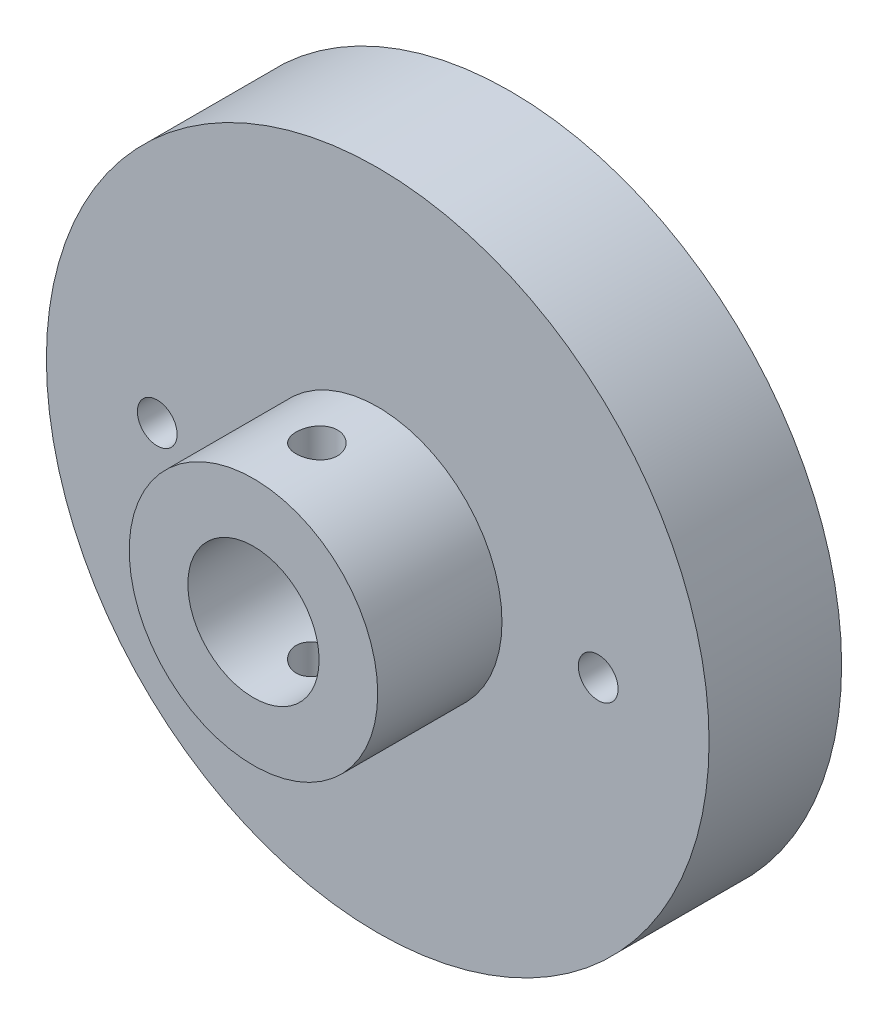
ISO-10303-21;
HEADER;
FILE_DESCRIPTION(('STEP AP214'),'2;1');
FILE_NAME('part.step','',(''),(''),'','','');
FILE_SCHEMA(('AUTOMOTIVE_DESIGN { 1 0 10303 214 1 1 1 1 }'));
ENDSEC;
DATA;
#1=APPLICATION_CONTEXT('core data for automotive mechanical design processes');
#2=APPLICATION_PROTOCOL_DEFINITION('international standard','automotive_design',2000,#1);
#3=PRODUCT_CONTEXT('',#1,'mechanical');
#4=PRODUCT('Part','Part','',(#3));
#5=PRODUCT_RELATED_PRODUCT_CATEGORY('part','',(#4));
#6=PRODUCT_DEFINITION_FORMATION('','',#4);
#7=PRODUCT_DEFINITION_CONTEXT('part definition',#1,'design');
#8=PRODUCT_DEFINITION('design','',#6,#7);
#9=PRODUCT_DEFINITION_SHAPE('','',#8);
#10=(LENGTH_UNIT() NAMED_UNIT(*) SI_UNIT(.MILLI.,.METRE.));
#11=(NAMED_UNIT(*) PLANE_ANGLE_UNIT() SI_UNIT($,.RADIAN.));
#12=(NAMED_UNIT(*) SI_UNIT($,.STERADIAN.) SOLID_ANGLE_UNIT());
#13=UNCERTAINTY_MEASURE_WITH_UNIT(LENGTH_MEASURE(1.E-05),#10,'distance_accuracy_value','');
#14=(GEOMETRIC_REPRESENTATION_CONTEXT(3) GLOBAL_UNCERTAINTY_ASSIGNED_CONTEXT((#13)) GLOBAL_UNIT_ASSIGNED_CONTEXT((#10,
#11,#12)) REPRESENTATION_CONTEXT('',''));
#15=CARTESIAN_POINT('',(0.,0.,0.));
#16=DIRECTION('',(0.,0.,1.));
#17=DIRECTION('',(1.,0.,0.));
#18=AXIS2_PLACEMENT_3D('',#15,#16,#17);
#19=CARTESIAN_POINT('',(0.,0.,5.08));
#20=DIRECTION('',(0.,0.,-1.));
#21=DIRECTION('',(-1.,0.,0.));
#22=AXIS2_PLACEMENT_3D('',#19,#20,#21);
#23=CYLINDRICAL_SURFACE('',#22,12.7);
#24=CARTESIAN_POINT('',(0.,0.,5.08));
#25=DIRECTION('',(0.,0.,1.));
#26=DIRECTION('',(1.,0.,0.));
#27=AXIS2_PLACEMENT_3D('',#24,#25,#26);
#28=CIRCLE('',#27,12.7);
#29=CARTESIAN_POINT('',(12.7,0.,5.08));
#30=VERTEX_POINT('',#29);
#31=EDGE_CURVE('E10',#30,#30,#28,.T.);
#32=ORIENTED_EDGE('',*,*,#31,.F.);
#33=EDGE_LOOP('',(#32));
#34=FACE_BOUND('',#33,.T.);
#35=CARTESIAN_POINT('',(0.,0.,0.));
#36=DIRECTION('',(0.,0.,1.));
#37=DIRECTION('',(1.,0.,0.));
#38=AXIS2_PLACEMENT_3D('',#35,#36,#37);
#39=CIRCLE('',#38,12.7);
#40=CARTESIAN_POINT('',(12.7,0.,0.));
#41=VERTEX_POINT('',#40);
#42=EDGE_CURVE('E49',#41,#41,#39,.T.);
#43=ORIENTED_EDGE('',*,*,#42,.T.);
#44=EDGE_LOOP('',(#43));
#45=FACE_BOUND('',#44,.T.);
#46=ADVANCED_FACE('F36',(#34,#45),#23,.T.);
#47=CARTESIAN_POINT('',(0.,0.,5.08));
#48=DIRECTION('',(0.,0.,1.));
#49=DIRECTION('',(1.,0.,0.));
#50=AXIS2_PLACEMENT_3D('',#47,#48,#49);
#51=PLANE('',#50);
#52=CARTESIAN_POINT('',(0.,0.,5.08));
#53=DIRECTION('',(0.,0.,1.));
#54=DIRECTION('',(1.,0.,0.));
#55=AXIS2_PLACEMENT_3D('',#52,#53,#54);
#56=CIRCLE('',#55,4.7625);
#57=CARTESIAN_POINT('',(4.7625,0.,5.08));
#58=VERTEX_POINT('',#57);
#59=EDGE_CURVE('E188',#58,#58,#56,.T.);
#60=ORIENTED_EDGE('',*,*,#59,.F.);
#61=EDGE_LOOP('',(#60));
#62=FACE_BOUND('',#61,.T.);
#63=CARTESIAN_POINT('',(-8.45058,0.,5.08));
#64=DIRECTION('',(0.,0.,1.));
#65=DIRECTION('',(1.,0.,0.));
#66=AXIS2_PLACEMENT_3D('',#63,#64,#65);
#67=CIRCLE('',#66,0.761999999999999);
#68=CARTESIAN_POINT('',(-7.68858,0.,5.08));
#69=VERTEX_POINT('',#68);
#70=EDGE_CURVE('E201',#69,#69,#67,.T.);
#71=ORIENTED_EDGE('',*,*,#70,.F.);
#72=EDGE_LOOP('',(#71));
#73=FACE_BOUND('',#72,.T.);
#74=CARTESIAN_POINT('',(8.45058,0.,5.08));
#75=DIRECTION('',(0.,0.,1.));
#76=DIRECTION('',(1.,0.,0.));
#77=AXIS2_PLACEMENT_3D('',#74,#75,#76);
#78=CIRCLE('',#77,0.762000000000001);
#79=CARTESIAN_POINT('',(9.21258,0.,5.08));
#80=VERTEX_POINT('',#79);
#81=EDGE_CURVE('E58',#80,#80,#78,.T.);
#82=ORIENTED_EDGE('',*,*,#81,.F.);
#83=EDGE_LOOP('',(#82));
#84=FACE_BOUND('',#83,.T.);
#85=ORIENTED_EDGE('',*,*,#31,.T.);
#86=EDGE_LOOP('',(#85));
#87=FACE_BOUND('',#86,.T.);
#88=ADVANCED_FACE('F107',(#62,#73,#84,#87),#51,.T.);
#89=CARTESIAN_POINT('',(0.,0.,0.));
#90=DIRECTION('',(0.,0.,1.));
#91=DIRECTION('',(1.,0.,0.));
#92=AXIS2_PLACEMENT_3D('',#89,#90,#91);
#93=PLANE('',#92);
#94=CARTESIAN_POINT('',(0.,0.,0.));
#95=DIRECTION('',(0.,0.,1.));
#96=DIRECTION('',(1.,0.,0.));
#97=AXIS2_PLACEMENT_3D('',#94,#95,#96);
#98=CIRCLE('',#97,2.5146);
#99=CARTESIAN_POINT('',(2.5146,0.,0.));
#100=VERTEX_POINT('',#99);
#101=EDGE_CURVE('E190',#100,#100,#98,.T.);
#102=ORIENTED_EDGE('',*,*,#101,.T.);
#103=EDGE_LOOP('',(#102));
#104=FACE_BOUND('',#103,.T.);
#105=CARTESIAN_POINT('',(-8.45058,0.,0.));
#106=DIRECTION('',(0.,0.,1.));
#107=DIRECTION('',(1.,0.,0.));
#108=AXIS2_PLACEMENT_3D('',#105,#106,#107);
#109=CIRCLE('',#108,0.761999999999999);
#110=CARTESIAN_POINT('',(-7.68858,0.,0.));
#111=VERTEX_POINT('',#110);
#112=EDGE_CURVE('E55',#111,#111,#109,.T.);
#113=ORIENTED_EDGE('',*,*,#112,.T.);
#114=EDGE_LOOP('',(#113));
#115=FACE_BOUND('',#114,.T.);
#116=CARTESIAN_POINT('',(8.45058,0.,0.));
#117=DIRECTION('',(0.,0.,1.));
#118=DIRECTION('',(1.,0.,0.));
#119=AXIS2_PLACEMENT_3D('',#116,#117,#118);
#120=CIRCLE('',#119,0.762000000000001);
#121=CARTESIAN_POINT('',(9.21258,0.,0.));
#122=VERTEX_POINT('',#121);
#123=EDGE_CURVE('E204',#122,#122,#120,.T.);
#124=ORIENTED_EDGE('',*,*,#123,.T.);
#125=EDGE_LOOP('',(#124));
#126=FACE_BOUND('',#125,.T.);
#127=ORIENTED_EDGE('',*,*,#42,.F.);
#128=EDGE_LOOP('',(#127));
#129=FACE_BOUND('',#128,.T.);
#130=ADVANCED_FACE('F105',(#104,#115,#126,#129),#93,.F.);
#131=CARTESIAN_POINT('',(8.45058,0.,0.));
#132=DIRECTION('',(0.,0.,1.));
#133=DIRECTION('',(1.,0.,0.));
#134=AXIS2_PLACEMENT_3D('',#131,#132,#133);
#135=CYLINDRICAL_SURFACE('',#134,0.762000000000001);
#136=ORIENTED_EDGE('',*,*,#123,.F.);
#137=EDGE_LOOP('',(#136));
#138=FACE_BOUND('',#137,.T.);
#139=ORIENTED_EDGE('',*,*,#81,.T.);
#140=EDGE_LOOP('',(#139));
#141=FACE_BOUND('',#140,.T.);
#142=ADVANCED_FACE('F101',(#138,#141),#135,.F.);
#143=CARTESIAN_POINT('',(-8.45058,0.,0.));
#144=DIRECTION('',(0.,0.,1.));
#145=DIRECTION('',(1.,0.,0.));
#146=AXIS2_PLACEMENT_3D('',#143,#144,#145);
#147=CYLINDRICAL_SURFACE('',#146,0.761999999999999);
#148=ORIENTED_EDGE('',*,*,#112,.F.);
#149=EDGE_LOOP('',(#148));
#150=FACE_BOUND('',#149,.T.);
#151=ORIENTED_EDGE('',*,*,#70,.T.);
#152=EDGE_LOOP('',(#151));
#153=FACE_BOUND('',#152,.T.);
#154=ADVANCED_FACE('F96',(#150,#153),#147,.F.);
#155=CARTESIAN_POINT('',(0.,0.,9.8425));
#156=DIRECTION('',(0.,0.,-1.));
#157=DIRECTION('',(-1.,0.,0.));
#158=AXIS2_PLACEMENT_3D('',#155,#156,#157);
#159=CYLINDRICAL_SURFACE('',#158,4.7625);
#160=CARTESIAN_POINT('',(0.,-4.7625,8.20729272143013));
#161=CARTESIAN_POINT('',(0.0442566123242315,-4.76249924171101,8.2072909469392));
#162=CARTESIAN_POINT('',(0.0885373774838239,-4.76187667737388,8.2035788366275));
#163=CARTESIAN_POINT('',(0.175856970381189,-4.7594530951889,8.18883464977214));
#164=CARTESIAN_POINT('',(0.218894618077059,-4.75765099370835,8.1777958421107));
#165=CARTESIAN_POINT('',(0.302452007240013,-4.75307046665073,8.14874081650193));
#166=CARTESIAN_POINT('',(0.342973776977127,-4.75029283988044,8.13073030608925));
#167=CARTESIAN_POINT('',(0.420415034827996,-4.74406667098557,8.0882580687035));
#168=CARTESIAN_POINT('',(0.457334934286451,-4.74061820560783,8.06379707957928));
#169=CARTESIAN_POINT('',(0.526882555037607,-4.73339578293014,8.00886948231714));
#170=CARTESIAN_POINT('',(0.559470846872351,-4.72961929301217,7.97835327753316));
#171=CARTESIAN_POINT('',(0.619089598324525,-4.72218584033363,7.91228824144002));
#172=CARTESIAN_POINT('',(0.646119707056632,-4.71852888513147,7.87673909264266));
#173=CARTESIAN_POINT('',(0.694012812379628,-4.7117240212873,7.80134643966257));
#174=CARTESIAN_POINT('',(0.714836820533366,-4.70857938486594,7.76147784699462));
#175=CARTESIAN_POINT('',(0.74947728101806,-4.70319033259809,7.67874743476469));
#176=CARTESIAN_POINT('',(0.76329420669708,-4.70094585594543,7.63588581761249));
#177=CARTESIAN_POINT('',(0.783404064946675,-4.69763645447575,7.54880398416318));
#178=CARTESIAN_POINT('',(0.789765066750488,-4.6965608649421,7.50459990009094));
#179=CARTESIAN_POINT('',(0.794993560279533,-4.69567875612386,7.41573973351963));
#180=CARTESIAN_POINT('',(0.793861582323505,-4.69587214702666,7.37108368323202));
#181=CARTESIAN_POINT('',(0.784191693740776,-4.69749641164179,7.28307312547518));
#182=CARTESIAN_POINT('',(0.775730250000001,-4.69891450778756,7.23970994630452));
#183=CARTESIAN_POINT('',(0.751761622078092,-4.70280839729495,7.15502745301938));
#184=CARTESIAN_POINT('',(0.736254196246516,-4.70528422693264,7.11370820905802));
#185=CARTESIAN_POINT('',(0.698556275634816,-4.71102842188577,7.03405756998764));
#186=CARTESIAN_POINT('',(0.676334027656808,-4.71430053806576,6.99574148499934));
#187=CARTESIAN_POINT('',(0.625859815574484,-4.72126601596765,6.9233530742592));
#188=CARTESIAN_POINT('',(0.597607364807735,-4.72495941167736,6.88928109137569));
#189=CARTESIAN_POINT('',(0.535458102360498,-4.73240743851832,6.8259054391863));
#190=CARTESIAN_POINT('',(0.501495683529717,-4.7361622613105,6.79666609179366));
#191=CARTESIAN_POINT('',(0.429112441551671,-4.7432677594346,6.74429153178389));
#192=CARTESIAN_POINT('',(0.390691589680287,-4.74661843216244,6.72115635849696));
#193=CARTESIAN_POINT('',(0.310421628382929,-4.752542859935,6.68164101431436));
#194=CARTESIAN_POINT('',(0.268569670366778,-4.75511596094364,6.66526652579246));
#195=CARTESIAN_POINT('',(0.182657224728865,-4.75919007206519,6.63979705808954));
#196=CARTESIAN_POINT('',(0.138596922189479,-4.76069117186275,6.63070146994098));
#197=CARTESIAN_POINT('',(0.0500728936632639,-4.76244008725053,6.62013519011872));
#198=CARTESIAN_POINT('',(0.00561998404544439,-4.76270241581559,6.61857619738185));
#199=CARTESIAN_POINT('',(-0.082911877892541,-4.76198398128722,6.62289194828606));
#200=CARTESIAN_POINT('',(-0.126990844535724,-4.76100326602408,6.62876640590009));
#201=CARTESIAN_POINT('',(-0.213250835736099,-4.75791792552879,6.64770886109415));
#202=CARTESIAN_POINT('',(-0.255441725712359,-4.75582013274416,6.660733142594));
#203=CARTESIAN_POINT('',(-0.337041135943192,-4.75073492464576,6.69355893095848));
#204=CARTESIAN_POINT('',(-0.376449499801337,-4.74774745937566,6.71336081840433));
#205=CARTESIAN_POINT('',(-0.451748743906395,-4.74117833926014,6.75938195352136));
#206=CARTESIAN_POINT('',(-0.487605467172546,-4.7375916674413,6.78565635851324));
#207=CARTESIAN_POINT('',(-0.554432338397105,-4.73023713396929,6.84380081906489));
#208=CARTESIAN_POINT('',(-0.585402131103666,-4.72646925916966,6.87567128107047));
#209=CARTESIAN_POINT('',(-0.641903332541417,-4.71913005637381,6.94449919294281));
#210=CARTESIAN_POINT('',(-0.667375081653606,-4.71556116873531,6.98150591898096));
#211=CARTESIAN_POINT('',(-0.711740483518659,-4.70906960704478,7.05932478913162));
#212=CARTESIAN_POINT('',(-0.73063434478942,-4.70614691250961,7.10013681256486));
#213=CARTESIAN_POINT('',(-0.761218420242726,-4.70129696549021,7.18424096159799));
#214=CARTESIAN_POINT('',(-0.772938329833974,-4.69936561493763,7.22752204160231));
#215=CARTESIAN_POINT('',(-0.788935256574605,-4.69670675095195,7.31547336245804));
#216=CARTESIAN_POINT('',(-0.79321292079291,-4.69597913286014,7.36014348219506));
#217=CARTESIAN_POINT('',(-0.794185884970036,-4.69581462754174,7.4490091116232));
#218=CARTESIAN_POINT('',(-0.790975093219748,-4.69636175440544,7.49320359162779));
#219=CARTESIAN_POINT('',(-0.777265348868801,-4.69865005611559,7.58041413268625));
#220=CARTESIAN_POINT('',(-0.766766419890713,-4.70039122709185,7.62343019755918));
#221=CARTESIAN_POINT('',(-0.738814400446383,-4.70486535619446,7.70702652527054));
#222=CARTESIAN_POINT('',(-0.721369395015642,-4.70759716092245,7.74760955712292));
#223=CARTESIAN_POINT('',(-0.680030073743303,-4.71374587132801,7.8252880463995));
#224=CARTESIAN_POINT('',(-0.656135438027671,-4.71716281098317,7.86238333072328));
#225=CARTESIAN_POINT('',(-0.602239995788161,-4.72434746659485,7.93250776906685));
#226=CARTESIAN_POINT('',(-0.572170103940985,-4.72811886345476,7.96548345673247));
#227=CARTESIAN_POINT('',(-0.506923367463225,-4.73555813224567,8.02595310585093));
#228=CARTESIAN_POINT('',(-0.471745345849764,-4.73922598008428,8.05344580047275));
#229=CARTESIAN_POINT('',(-0.396992211360791,-4.74607423161405,8.10234254658362));
#230=CARTESIAN_POINT('',(-0.357388410041672,-4.74925109410361,8.12370323891199));
#231=CARTESIAN_POINT('',(-0.275117899527829,-4.75472495713564,8.15943578279378));
#232=CARTESIAN_POINT('',(-0.232454289608531,-4.7570228334635,8.17381459467294));
#233=CARTESIAN_POINT('',(-0.158020800939417,-4.75997838589463,8.19205439596535));
#234=CARTESIAN_POINT('',(-0.126701178619759,-4.76091893659291,8.1977596155332));
#235=CARTESIAN_POINT('',(-0.0635918560265413,-4.76218001075593,8.20537938319584));
#236=CARTESIAN_POINT('',(-0.0318021638556987,-4.76250054489554,8.20729399655374));
#237=CARTESIAN_POINT('',(0.,-4.7625,8.20729272143013));
#238=B_SPLINE_CURVE_WITH_KNOTS('',3,(#160,#161,#162,#163,#164,#165,#166,#167,#168,#169,#170,
#171,#172,#173,#174,#175,#176,#177,#178,#179,#180,#181,#182,#183,#184,#185,#186,#187,#188,#189,
#190,#191,#192,#193,#194,#195,#196,#197,#198,#199,#200,#201,#202,#203,#204,#205,#206,#207,#208,
#209,#210,#211,#212,#213,#214,#215,#216,#217,#218,#219,#220,#221,#222,#223,#224,#225,#226,#227,
#228,#229,#230,#231,#232,#233,#234,#235,#236,#237),.UNSPECIFIED.,.T.,.F.,(4,2,2,2,2,2,2,2,2,2,2,
2,2,2,2,2,2,2,2,2,2,2,2,2,2,2,2,2,2,2,2,2,2,2,2,2,2,2,4),(0.,0.132653590717977,
0.265429220758296,0.398096380280523,0.530748371024247,0.664535409122905,0.798330890539294,
0.932950003615691,1.06756002158187,1.20093129480337,1.33429312871881,1.4662801565893,
1.59827171145558,1.73089746730837,1.86353393066082,1.99781404446846,2.13209502344382,
2.26648863730799,2.40087100635465,2.53367503008519,2.66647394388885,2.79846978724537,
2.93047304374776,3.0636426713658,3.19682197519735,3.33138088487419,3.46593552866862,
3.59992937093513,3.73391156247251,3.86622261273457,3.99853323414732,4.13069029786826,
4.26285391721814,4.39658564481402,4.53034823506574,4.66503458535286,4.79958638801298,
4.89491098792076,4.99023394660437),.UNSPECIFIED.);
#239=CARTESIAN_POINT('',(0.,-4.7625,8.20729272143013));
#240=VERTEX_POINT('',#239);
#241=EDGE_CURVE('E86',#240,#240,#238,.T.);
#242=ORIENTED_EDGE('',*,*,#241,.T.);
#243=EDGE_LOOP('',(#242));
#244=FACE_BOUND('',#243,.T.);
#245=CARTESIAN_POINT('',(0.,4.7625,8.20729272143013));
#246=CARTESIAN_POINT('',(-0.0442566123242351,4.76249924171102,8.2072909469392));
#247=CARTESIAN_POINT('',(-0.0885373774838276,4.76187667737388,8.2035788366275));
#248=CARTESIAN_POINT('',(-0.175856970381193,4.7594530951889,8.18883464977214));
#249=CARTESIAN_POINT('',(-0.218894618077063,4.75765099370835,8.1777958421107));
#250=CARTESIAN_POINT('',(-0.302452007240017,4.75307046665073,8.14874081650193));
#251=CARTESIAN_POINT('',(-0.342973776977131,4.75029283988044,8.13073030608925));
#252=CARTESIAN_POINT('',(-0.420415034828,4.74406667098557,8.0882580687035));
#253=CARTESIAN_POINT('',(-0.457334934286455,4.74061820560783,8.06379707957928));
#254=CARTESIAN_POINT('',(-0.526882555037611,4.73339578293014,8.00886948231714));
#255=CARTESIAN_POINT('',(-0.559470846872355,4.72961929301217,7.97835327753316));
#256=CARTESIAN_POINT('',(-0.61908959832453,4.72218584033362,7.91228824144001));
#257=CARTESIAN_POINT('',(-0.646119707056636,4.71852888513147,7.87673909264266));
#258=CARTESIAN_POINT('',(-0.694012812379632,4.7117240212873,7.80134643966257));
#259=CARTESIAN_POINT('',(-0.71483682053337,4.70857938486594,7.76147784699462));
#260=CARTESIAN_POINT('',(-0.749477281018064,4.70319033259809,7.67874743476468));
#261=CARTESIAN_POINT('',(-0.763294206697084,4.70094585594543,7.63588581761248));
#262=CARTESIAN_POINT('',(-0.783404064946678,4.69763645447575,7.54880398416318));
#263=CARTESIAN_POINT('',(-0.789765066750492,4.6965608649421,7.50459990009094));
#264=CARTESIAN_POINT('',(-0.794993560279537,4.69567875612386,7.41573973351963));
#265=CARTESIAN_POINT('',(-0.793861582323508,4.69587214702665,7.37108368323201));
#266=CARTESIAN_POINT('',(-0.78419169374078,4.69749641164179,7.28307312547518));
#267=CARTESIAN_POINT('',(-0.775730250000005,4.69891450778756,7.23970994630452));
#268=CARTESIAN_POINT('',(-0.751761622078095,4.70280839729495,7.15502745301938));
#269=CARTESIAN_POINT('',(-0.736254196246519,4.70528422693264,7.11370820905802));
#270=CARTESIAN_POINT('',(-0.698556275634819,4.71102842188577,7.03405756998764));
#271=CARTESIAN_POINT('',(-0.676334027656811,4.71430053806576,6.99574148499934));
#272=CARTESIAN_POINT('',(-0.625859815574487,4.72126601596765,6.9233530742592));
#273=CARTESIAN_POINT('',(-0.597607364807738,4.72495941167736,6.88928109137569));
#274=CARTESIAN_POINT('',(-0.535458102360501,4.73240743851832,6.8259054391863));
#275=CARTESIAN_POINT('',(-0.50149568352972,4.7361622613105,6.79666609179366));
#276=CARTESIAN_POINT('',(-0.429112441551675,4.7432677594346,6.74429153178389));
#277=CARTESIAN_POINT('',(-0.390691589680291,4.74661843216244,6.72115635849696));
#278=CARTESIAN_POINT('',(-0.310421628382932,4.752542859935,6.68164101431436));
#279=CARTESIAN_POINT('',(-0.268569670366781,4.75511596094364,6.66526652579246));
#280=CARTESIAN_POINT('',(-0.182657224728869,4.75919007206519,6.63979705808954));
#281=CARTESIAN_POINT('',(-0.138596922189483,4.76069117186275,6.63070146994098));
#282=CARTESIAN_POINT('',(-0.0500728936632671,4.76244008725053,6.62013519011872));
#283=CARTESIAN_POINT('',(-0.00561998404544757,4.76270241581559,6.61857619738185));
#284=CARTESIAN_POINT('',(0.082911877892538,4.76198398128722,6.62289194828606));
#285=CARTESIAN_POINT('',(0.126990844535721,4.76100326602408,6.62876640590009));
#286=CARTESIAN_POINT('',(0.213250835736096,4.75791792552879,6.64770886109415));
#287=CARTESIAN_POINT('',(0.255441725712357,4.75582013274416,6.660733142594));
#288=CARTESIAN_POINT('',(0.337041135943189,4.75073492464576,6.69355893095849));
#289=CARTESIAN_POINT('',(0.376449499801335,4.74774745937566,6.71336081840433));
#290=CARTESIAN_POINT('',(0.451748743906394,4.74117833926014,6.75938195352136));
#291=CARTESIAN_POINT('',(0.487605467172544,4.7375916674413,6.78565635851324));
#292=CARTESIAN_POINT('',(0.554432338397103,4.73023713396929,6.84380081906489));
#293=CARTESIAN_POINT('',(0.585402131103664,4.72646925916966,6.87567128107048));
#294=CARTESIAN_POINT('',(0.641903332541415,4.71913005637381,6.94449919294281));
#295=CARTESIAN_POINT('',(0.667375081653604,4.71556116873531,6.98150591898096));
#296=CARTESIAN_POINT('',(0.711740483518657,4.70906960704478,7.05932478913162));
#297=CARTESIAN_POINT('',(0.730634344789417,4.70614691250961,7.10013681256486));
#298=CARTESIAN_POINT('',(0.761218420242723,4.70129696549021,7.18424096159799));
#299=CARTESIAN_POINT('',(0.772938329833971,4.69936561493763,7.22752204160231));
#300=CARTESIAN_POINT('',(0.788935256574602,4.69670675095195,7.31547336245804));
#301=CARTESIAN_POINT('',(0.793212920792907,4.69597913286014,7.36014348219506));
#302=CARTESIAN_POINT('',(0.794185884970033,4.69581462754174,7.4490091116232));
#303=CARTESIAN_POINT('',(0.790975093219745,4.69636175440544,7.49320359162779));
#304=CARTESIAN_POINT('',(0.777265348868797,4.69865005611559,7.58041413268625));
#305=CARTESIAN_POINT('',(0.766766419890709,4.70039122709185,7.62343019755918));
#306=CARTESIAN_POINT('',(0.738814400446379,4.70486535619446,7.70702652527054));
#307=CARTESIAN_POINT('',(0.721369395015639,4.70759716092245,7.74760955712292));
#308=CARTESIAN_POINT('',(0.680030073743299,4.71374587132801,7.8252880463995));
#309=CARTESIAN_POINT('',(0.656135438027667,4.71716281098317,7.86238333072328));
#310=CARTESIAN_POINT('',(0.602239995788158,4.72434746659485,7.93250776906685));
#311=CARTESIAN_POINT('',(0.572170103940982,4.72811886345476,7.96548345673247));
#312=CARTESIAN_POINT('',(0.506923367463222,4.73555813224567,8.02595310585093));
#313=CARTESIAN_POINT('',(0.47174534584976,4.73922598008429,8.05344580047275));
#314=CARTESIAN_POINT('',(0.396992211360787,4.74607423161405,8.10234254658362));
#315=CARTESIAN_POINT('',(0.357388410041668,4.74925109410361,8.12370323891199));
#316=CARTESIAN_POINT('',(0.275117899527826,4.75472495713564,8.15943578279378));
#317=CARTESIAN_POINT('',(0.232454289608527,4.7570228334635,8.17381459467294));
#318=CARTESIAN_POINT('',(0.158020800939413,4.75997838589463,8.19205439596535));
#319=CARTESIAN_POINT('',(0.126701178619755,4.76091893659291,8.1977596155332));
#320=CARTESIAN_POINT('',(0.0635918560265376,4.76218001075593,8.20537938319584));
#321=CARTESIAN_POINT('',(0.0318021638556951,4.76250054489554,8.20729399655374));
#322=CARTESIAN_POINT('',(0.,4.7625,8.20729272143013));
#323=B_SPLINE_CURVE_WITH_KNOTS('',3,(#245,#246,#247,#248,#249,#250,#251,#252,#253,#254,#255,
#256,#257,#258,#259,#260,#261,#262,#263,#264,#265,#266,#267,#268,#269,#270,#271,#272,#273,#274,
#275,#276,#277,#278,#279,#280,#281,#282,#283,#284,#285,#286,#287,#288,#289,#290,#291,#292,#293,
#294,#295,#296,#297,#298,#299,#300,#301,#302,#303,#304,#305,#306,#307,#308,#309,#310,#311,#312,
#313,#314,#315,#316,#317,#318,#319,#320,#321,#322),.UNSPECIFIED.,.T.,.F.,(4,2,2,2,2,2,2,2,2,2,2,
2,2,2,2,2,2,2,2,2,2,2,2,2,2,2,2,2,2,2,2,2,2,2,2,2,2,2,4),(0.,0.132653590717977,
0.265429220758297,0.398096380280524,0.530748371024247,0.664535409122906,0.798330890539297,
0.932950003615693,1.06756002158188,1.20093129480337,1.33429312871882,1.4662801565893,
1.59827171145558,1.73089746730837,1.86353393066082,1.99781404446846,2.13209502344382,
2.26648863730799,2.40087100635465,2.53367503008519,2.66647394388885,2.79846978724537,
2.93047304374776,3.0636426713658,3.19682197519735,3.33138088487419,3.46593552866862,
3.59992937093513,3.73391156247251,3.86622261273457,3.99853323414732,4.13069029786826,
4.26285391721814,4.39658564481402,4.53034823506574,4.66503458535286,4.79958638801298,
4.89491098792076,4.99023394660437),.UNSPECIFIED.);
#324=CARTESIAN_POINT('',(0.,4.7625,8.20729272143013));
#325=VERTEX_POINT('',#324);
#326=EDGE_CURVE('E79',#325,#325,#323,.T.);
#327=ORIENTED_EDGE('',*,*,#326,.T.);
#328=EDGE_LOOP('',(#327));
#329=FACE_BOUND('',#328,.T.);
#330=CARTESIAN_POINT('',(0.,0.,9.8425));
#331=DIRECTION('',(0.,0.,1.));
#332=DIRECTION('',(1.,0.,0.));
#333=AXIS2_PLACEMENT_3D('',#330,#331,#332);
#334=CIRCLE('',#333,4.7625);
#335=CARTESIAN_POINT('',(4.7625,0.,9.8425));
#336=VERTEX_POINT('',#335);
#337=EDGE_CURVE('E185',#336,#336,#334,.T.);
#338=ORIENTED_EDGE('',*,*,#337,.F.);
#339=EDGE_LOOP('',(#338));
#340=FACE_BOUND('',#339,.T.);
#341=ORIENTED_EDGE('',*,*,#59,.T.);
#342=EDGE_LOOP('',(#341));
#343=FACE_BOUND('',#342,.T.);
#344=ADVANCED_FACE('F91',(#244,#329,#340,#343),#159,.T.);
#345=CARTESIAN_POINT('',(0.,0.,9.8425));
#346=DIRECTION('',(0.,0.,1.));
#347=DIRECTION('',(1.,0.,0.));
#348=AXIS2_PLACEMENT_3D('',#345,#346,#347);
#349=PLANE('',#348);
#350=CARTESIAN_POINT('',(0.,0.,9.8425));
#351=DIRECTION('',(0.,0.,1.));
#352=DIRECTION('',(1.,0.,0.));
#353=AXIS2_PLACEMENT_3D('',#350,#351,#352);
#354=CIRCLE('',#353,2.5146);
#355=CARTESIAN_POINT('',(2.5146,0.,9.8425));
#356=VERTEX_POINT('',#355);
#357=EDGE_CURVE('E195',#356,#356,#354,.T.);
#358=ORIENTED_EDGE('',*,*,#357,.F.);
#359=EDGE_LOOP('',(#358));
#360=FACE_BOUND('',#359,.T.);
#361=ORIENTED_EDGE('',*,*,#337,.T.);
#362=EDGE_LOOP('',(#361));
#363=FACE_BOUND('',#362,.T.);
#364=ADVANCED_FACE('F95',(#360,#363),#349,.T.);
#365=CARTESIAN_POINT('',(0.,0.,0.));
#366=DIRECTION('',(0.,0.,1.));
#367=DIRECTION('',(1.,0.,0.));
#368=AXIS2_PLACEMENT_3D('',#365,#366,#367);
#369=CYLINDRICAL_SURFACE('',#368,2.5146);
#370=CARTESIAN_POINT('',(0.,-2.5146,8.20729272143013));
#371=CARTESIAN_POINT('',(-0.0434368093731067,-2.51459982822438,8.20729250478135));
#372=CARTESIAN_POINT('',(-0.0868759768542417,-2.51346393109926,8.20371546917579));
#373=CARTESIAN_POINT('',(-0.172482604052519,-2.50904398501311,8.18954026355238));
#374=CARTESIAN_POINT('',(-0.214649797381477,-2.50575948929627,8.17894063332808));
#375=CARTESIAN_POINT('',(-0.296465694801657,-2.49740087120117,8.15111427249134));
#376=CARTESIAN_POINT('',(-0.336118231043191,-2.49232955310177,8.13389792248441));
#377=CARTESIAN_POINT('',(-0.411973566997993,-2.4809200186081,8.09337140545021));
#378=CARTESIAN_POINT('',(-0.448175800657047,-2.4745815948599,8.07006024085217));
#379=CARTESIAN_POINT('',(-0.517241363882831,-2.46108688820685,8.01723447922004));
#380=CARTESIAN_POINT('',(-0.549981010278631,-2.45391251939415,7.98756281515975));
#381=CARTESIAN_POINT('',(-0.610111864083335,-2.439658483836,7.92319267575524));
#382=CARTESIAN_POINT('',(-0.637502050030351,-2.43257883541703,7.88849324257411));
#383=CARTESIAN_POINT('',(-0.686832305130433,-2.41912103793536,7.81397552922527));
#384=CARTESIAN_POINT('',(-0.708616941258543,-2.41276517041613,7.77404994664981));
#385=CARTESIAN_POINT('',(-0.74511099382358,-2.40174703047522,7.69086881418824));
#386=CARTESIAN_POINT('',(-0.759822317108065,-2.39708430169455,7.64761416541485));
#387=CARTESIAN_POINT('',(-0.781297878571482,-2.39016973647462,7.56040008742412));
#388=CARTESIAN_POINT('',(-0.788291902810261,-2.38784837799687,7.51650290748092));
#389=CARTESIAN_POINT('',(-0.79485229093022,-2.38567308098525,7.42810152299312));
#390=CARTESIAN_POINT('',(-0.794420675629434,-2.38581847114876,7.3835974868929));
#391=CARTESIAN_POINT('',(-0.786321565457769,-2.38849894495377,7.29715500983021));
#392=CARTESIAN_POINT('',(-0.778947299409598,-2.39093718333115,7.2551855841718));
#393=CARTESIAN_POINT('',(-0.757648077375717,-2.39777112811578,7.17311307585325));
#394=CARTESIAN_POINT('',(-0.743722412291067,-2.40216704641223,7.1330101957375));
#395=CARTESIAN_POINT('',(-0.709510878443915,-2.41249448463733,7.055115420682));
#396=CARTESIAN_POINT('',(-0.689133708961464,-2.41844782056757,7.01736664189624));
#397=CARTESIAN_POINT('',(-0.642660999946763,-2.43120943462547,6.94572857888139));
#398=CARTESIAN_POINT('',(-0.616563949755914,-2.43801793840546,6.91184031784085));
#399=CARTESIAN_POINT('',(-0.557957908886097,-2.45211015215851,6.8472289561674));
#400=CARTESIAN_POINT('',(-0.525207186747353,-2.45940123735089,6.81672631763631));
#401=CARTESIAN_POINT('',(-0.45496474140044,-2.47335819638317,6.76159203674036));
#402=CARTESIAN_POINT('',(-0.417472652899418,-2.4800240219817,6.73696084715648));
#403=CARTESIAN_POINT('',(-0.338380581296839,-2.49205186203037,6.69411519160876));
#404=CARTESIAN_POINT('',(-0.296749811639198,-2.4974028893689,6.67595426355364));
#405=CARTESIAN_POINT('',(-0.210815782857338,-2.50611885134178,6.64695917510369));
#406=CARTESIAN_POINT('',(-0.16651335703324,-2.50948440175882,6.63612274291223));
#407=CARTESIAN_POINT('',(-0.0783642014704762,-2.51375068278138,6.62246201331261));
#408=CARTESIAN_POINT('',(-0.0345680839530335,-2.51474315281178,6.61933934775528));
#409=CARTESIAN_POINT('',(0.0529275984339353,-2.51442333563245,6.62035226293478));
#410=CARTESIAN_POINT('',(0.0966271767500502,-2.51311139270833,6.62448675943163));
#411=CARTESIAN_POINT('',(0.181532064473338,-2.50839049097728,6.63965758582543));
#412=CARTESIAN_POINT('',(0.22277255003091,-2.50503576166448,6.65051555099723));
#413=CARTESIAN_POINT('',(0.302834170302684,-2.49662298480436,6.67860666610909));
#414=CARTESIAN_POINT('',(0.341655003756662,-2.49156472565808,6.69584060804863));
#415=CARTESIAN_POINT('',(0.416841500899181,-2.4801086962471,6.73666948626882));
#416=CARTESIAN_POINT('',(0.453122906943343,-2.47368094331063,6.76041093758489));
#417=CARTESIAN_POINT('',(0.521286398974396,-2.46022006357876,6.81340567733257));
#418=CARTESIAN_POINT('',(0.553167264682393,-2.45318676974006,6.84266048933212));
#419=CARTESIAN_POINT('',(0.612964895583202,-2.43894875770342,6.90725503110482));
#420=CARTESIAN_POINT('',(0.640668940337815,-2.43174862598838,6.94279314773261));
#421=CARTESIAN_POINT('',(0.689740334420172,-2.41828887921015,7.01817024157648));
#422=CARTESIAN_POINT('',(0.711107764884277,-2.41202925210489,7.05800916371455));
#423=CARTESIAN_POINT('',(0.746770747317489,-2.40122774001174,7.14078770933896));
#424=CARTESIAN_POINT('',(0.761092019959925,-2.39667962200227,7.18371538983342));
#425=CARTESIAN_POINT('',(0.782249647679309,-2.38985870419428,7.2715465084282));
#426=CARTESIAN_POINT('',(0.789088926052956,-2.38758501578106,7.31644916774467));
#427=CARTESIAN_POINT('',(0.794875727863934,-2.38566426486293,7.40472819631984));
#428=CARTESIAN_POINT('',(0.794172805569398,-2.38590085401027,7.44807939937397));
#429=CARTESIAN_POINT('',(0.785741430648288,-2.3886906109816,7.53401332145383));
#430=CARTESIAN_POINT('',(0.778013318342637,-2.3912436665891,7.57659607760349));
#431=CARTESIAN_POINT('',(0.755986996359257,-2.39829657945981,7.65914531547862));
#432=CARTESIAN_POINT('',(0.741790750567629,-2.4027661623945,7.6991417869381));
#433=CARTESIAN_POINT('',(0.707311731697685,-2.41314025660087,7.77621693646522));
#434=CARTESIAN_POINT('',(0.687027702665879,-2.41904506392183,7.81329501045213));
#435=CARTESIAN_POINT('',(0.640004921169463,-2.43191750310028,7.88507882732144));
#436=CARTESIAN_POINT('',(0.61304137610134,-2.43891808502489,7.91963139041729));
#437=CARTESIAN_POINT('',(0.553818194535369,-2.45304383036926,7.98383455802081));
#438=CARTESIAN_POINT('',(0.521557129956344,-2.46016902691802,8.01348383638564));
#439=CARTESIAN_POINT('',(0.451352377914365,-2.47402806965203,8.06803592079007));
#440=CARTESIAN_POINT('',(0.413254316986341,-2.48074075734012,8.0927460431175));
#441=CARTESIAN_POINT('',(0.333233521258935,-2.49274982281401,8.13537907034387));
#442=CARTESIAN_POINT('',(0.291312221780503,-2.49804672920105,8.15330450943972));
#443=CARTESIAN_POINT('',(0.208240147407411,-2.5062825612279,8.18063740199287));
#444=CARTESIAN_POINT('',(0.167288069698993,-2.50937417141545,8.19060389306693));
#445=CARTESIAN_POINT('',(0.08422456819392,-2.51353275920399,8.2039309567394));
#446=CARTESIAN_POINT('',(0.0421133923994816,-2.51460016654203,8.20729293147814));
#447=CARTESIAN_POINT('',(0.,-2.5146,8.20729272143013));
#448=B_SPLINE_CURVE_WITH_KNOTS('',3,(#370,#371,#372,#373,#374,#375,#376,#377,#378,#379,#380,
#381,#382,#383,#384,#385,#386,#387,#388,#389,#390,#391,#392,#393,#394,#395,#396,#397,#398,#399,
#400,#401,#402,#403,#404,#405,#406,#407,#408,#409,#410,#411,#412,#413,#414,#415,#416,#417,#418,
#419,#420,#421,#422,#423,#424,#425,#426,#427,#428,#429,#430,#431,#432,#433,#434,#435,#436,#437,
#438,#439,#440,#441,#442,#443,#444,#445,#446,#447),.UNSPECIFIED.,.T.,.F.,(4,2,2,2,2,2,2,2,2,2,2,
2,2,2,2,2,2,2,2,2,2,2,2,2,2,2,2,2,2,2,2,2,2,2,2,2,2,2,4),(0.,0.130155606356995,
0.260338284435993,0.390317554364354,0.520318112024637,0.654002465932419,0.787712321524652,
0.924805288504001,1.06186127674765,1.19471595328445,1.32753447524131,1.45498356998985,
1.58244646252673,1.71180052041655,1.84118878282975,1.9765937479571,2.11200915155941,
2.2485203548763,2.38498919784725,2.51609046940714,2.64717215574355,2.77491716549687,
2.90267804857769,3.03359260191898,3.16454338551501,3.30079531079264,3.43704549137468,
3.57279455648074,3.70849056398407,3.83792576641615,3.96735469895941,4.09481036075176,
4.22229233566067,4.35484876019113,4.48744097751961,4.62448296803945,4.76147372036457,
4.8876905916217,5.01388066411121),.UNSPECIFIED.);
#449=CARTESIAN_POINT('',(0.,-2.5146,8.20729272143013));
#450=VERTEX_POINT('',#449);
#451=EDGE_CURVE('E39',#450,#450,#448,.T.);
#452=ORIENTED_EDGE('',*,*,#451,.T.);
#453=EDGE_LOOP('',(#452));
#454=FACE_BOUND('',#453,.T.);
#455=CARTESIAN_POINT('',(0.,2.5146,8.20729272143013));
#456=CARTESIAN_POINT('',(0.0434368093731033,2.51459982822438,8.20729250478135));
#457=CARTESIAN_POINT('',(0.0868759768542383,2.51346393109926,8.20371546917579));
#458=CARTESIAN_POINT('',(0.172482604052516,2.50904398501311,8.18954026355238));
#459=CARTESIAN_POINT('',(0.214649797381475,2.50575948929627,8.17894063332808));
#460=CARTESIAN_POINT('',(0.296465694801654,2.49740087120117,8.15111427249134));
#461=CARTESIAN_POINT('',(0.336118231043188,2.49232955310178,8.13389792248441));
#462=CARTESIAN_POINT('',(0.41197356699799,2.4809200186081,8.09337140545021));
#463=CARTESIAN_POINT('',(0.448175800657044,2.4745815948599,8.07006024085217));
#464=CARTESIAN_POINT('',(0.517241363882828,2.46108688820686,8.01723447922004));
#465=CARTESIAN_POINT('',(0.549981010278629,2.45391251939415,7.98756281515975));
#466=CARTESIAN_POINT('',(0.610111864083333,2.439658483836,7.92319267575524));
#467=CARTESIAN_POINT('',(0.637502050030349,2.43257883541703,7.88849324257411));
#468=CARTESIAN_POINT('',(0.686832305130431,2.41912103793536,7.81397552922527));
#469=CARTESIAN_POINT('',(0.70861694125854,2.41276517041613,7.77404994664981));
#470=CARTESIAN_POINT('',(0.745110993823577,2.40174703047522,7.69086881418824));
#471=CARTESIAN_POINT('',(0.759822317108062,2.39708430169455,7.64761416541485));
#472=CARTESIAN_POINT('',(0.781297878571478,2.39016973647462,7.56040008742412));
#473=CARTESIAN_POINT('',(0.788291902810258,2.38784837799687,7.51650290748092));
#474=CARTESIAN_POINT('',(0.794852290930217,2.38567308098525,7.42810152299312));
#475=CARTESIAN_POINT('',(0.79442067562943,2.38581847114876,7.3835974868929));
#476=CARTESIAN_POINT('',(0.786321565457766,2.38849894495377,7.29715500983021));
#477=CARTESIAN_POINT('',(0.778947299409595,2.39093718333116,7.2551855841718));
#478=CARTESIAN_POINT('',(0.757648077375713,2.39777112811578,7.17311307585325));
#479=CARTESIAN_POINT('',(0.743722412291063,2.40216704641223,7.1330101957375));
#480=CARTESIAN_POINT('',(0.709510878443912,2.41249448463733,7.055115420682));
#481=CARTESIAN_POINT('',(0.689133708961461,2.41844782056757,7.01736664189625));
#482=CARTESIAN_POINT('',(0.64266099994676,2.43120943462547,6.94572857888139));
#483=CARTESIAN_POINT('',(0.616563949755911,2.43801793840546,6.91184031784085));
#484=CARTESIAN_POINT('',(0.557957908886094,2.45211015215851,6.8472289561674));
#485=CARTESIAN_POINT('',(0.52520718674735,2.45940123735089,6.81672631763631));
#486=CARTESIAN_POINT('',(0.454964741400437,2.47335819638318,6.76159203674036));
#487=CARTESIAN_POINT('',(0.417472652899414,2.4800240219817,6.73696084715648));
#488=CARTESIAN_POINT('',(0.338380581296836,2.49205186203037,6.69411519160876));
#489=CARTESIAN_POINT('',(0.296749811639195,2.4974028893689,6.67595426355364));
#490=CARTESIAN_POINT('',(0.210815782857335,2.50611885134178,6.64695917510369));
#491=CARTESIAN_POINT('',(0.166513357033237,2.50948440175882,6.63612274291223));
#492=CARTESIAN_POINT('',(0.0783642014704726,2.51375068278138,6.62246201331261));
#493=CARTESIAN_POINT('',(0.0345680839530297,2.51474315281178,6.61933934775528));
#494=CARTESIAN_POINT('',(-0.0529275984339392,2.51442333563245,6.62035226293478));
#495=CARTESIAN_POINT('',(-0.096627176750054,2.51311139270833,6.62448675943163));
#496=CARTESIAN_POINT('',(-0.181532064473342,2.50839049097728,6.63965758582543));
#497=CARTESIAN_POINT('',(-0.222772550030914,2.50503576166448,6.65051555099723));
#498=CARTESIAN_POINT('',(-0.302834170302689,2.49662298480436,6.67860666610909));
#499=CARTESIAN_POINT('',(-0.341655003756667,2.49156472565808,6.69584060804863));
#500=CARTESIAN_POINT('',(-0.416841500899185,2.4801086962471,6.73666948626882));
#501=CARTESIAN_POINT('',(-0.453122906943347,2.47368094331062,6.76041093758489));
#502=CARTESIAN_POINT('',(-0.521286398974401,2.46022006357876,6.81340567733257));
#503=CARTESIAN_POINT('',(-0.553167264682398,2.45318676974006,6.84266048933212));
#504=CARTESIAN_POINT('',(-0.612964895583207,2.43894875770342,6.90725503110482));
#505=CARTESIAN_POINT('',(-0.64066894033782,2.43174862598838,6.94279314773261));
#506=CARTESIAN_POINT('',(-0.689740334420177,2.41828887921015,7.01817024157649));
#507=CARTESIAN_POINT('',(-0.711107764884282,2.41202925210489,7.05800916371456));
#508=CARTESIAN_POINT('',(-0.746770747317493,2.40122774001174,7.14078770933896));
#509=CARTESIAN_POINT('',(-0.761092019959929,2.39667962200227,7.18371538983342));
#510=CARTESIAN_POINT('',(-0.782249647679313,2.38985870419427,7.27154650842821));
#511=CARTESIAN_POINT('',(-0.789088926052959,2.38758501578106,7.31644916774468));
#512=CARTESIAN_POINT('',(-0.794875727863937,2.38566426486292,7.40472819631984));
#513=CARTESIAN_POINT('',(-0.794172805569401,2.38590085401027,7.44807939937397));
#514=CARTESIAN_POINT('',(-0.785741430648291,2.3886906109816,7.53401332145383));
#515=CARTESIAN_POINT('',(-0.77801331834264,2.3912436665891,7.57659607760349));
#516=CARTESIAN_POINT('',(-0.75598699635926,2.39829657945981,7.65914531547862));
#517=CARTESIAN_POINT('',(-0.741790750567632,2.4027661623945,7.6991417869381));
#518=CARTESIAN_POINT('',(-0.707311731697688,2.41314025660087,7.77621693646522));
#519=CARTESIAN_POINT('',(-0.687027702665882,2.41904506392183,7.81329501045213));
#520=CARTESIAN_POINT('',(-0.640004921169466,2.43191750310028,7.88507882732144));
#521=CARTESIAN_POINT('',(-0.613041376101343,2.43891808502489,7.91963139041729));
#522=CARTESIAN_POINT('',(-0.553818194535373,2.45304383036926,7.98383455802081));
#523=CARTESIAN_POINT('',(-0.521557129956347,2.46016902691802,8.01348383638564));
#524=CARTESIAN_POINT('',(-0.451352377914369,2.47402806965203,8.06803592079007));
#525=CARTESIAN_POINT('',(-0.413254316986345,2.48074075734012,8.0927460431175));
#526=CARTESIAN_POINT('',(-0.333233521258939,2.49274982281401,8.13537907034387));
#527=CARTESIAN_POINT('',(-0.291312221780507,2.49804672920105,8.15330450943972));
#528=CARTESIAN_POINT('',(-0.208240147407415,2.5062825612279,8.18063740199287));
#529=CARTESIAN_POINT('',(-0.167288069698996,2.50937417141545,8.19060389306693));
#530=CARTESIAN_POINT('',(-0.0842245681939236,2.51353275920398,8.2039309567394));
#531=CARTESIAN_POINT('',(-0.0421133923994851,2.51460016654203,8.20729293147814));
#532=CARTESIAN_POINT('',(0.,2.5146,8.20729272143013));
#533=B_SPLINE_CURVE_WITH_KNOTS('',3,(#455,#456,#457,#458,#459,#460,#461,#462,#463,#464,#465,
#466,#467,#468,#469,#470,#471,#472,#473,#474,#475,#476,#477,#478,#479,#480,#481,#482,#483,#484,
#485,#486,#487,#488,#489,#490,#491,#492,#493,#494,#495,#496,#497,#498,#499,#500,#501,#502,#503,
#504,#505,#506,#507,#508,#509,#510,#511,#512,#513,#514,#515,#516,#517,#518,#519,#520,#521,#522,
#523,#524,#525,#526,#527,#528,#529,#530,#531,#532),.UNSPECIFIED.,.T.,.F.,(4,2,2,2,2,2,2,2,2,2,2,
2,2,2,2,2,2,2,2,2,2,2,2,2,2,2,2,2,2,2,2,2,2,2,2,2,2,2,4),(0.,0.130155606356995,
0.260338284435994,0.390317554364354,0.520318112024639,0.65400246593242,0.787712321524655,
0.924805288504003,1.06186127674765,1.19471595328446,1.32753447524131,1.45498356998985,
1.58244646252673,1.71180052041655,1.84118878282975,1.9765937479571,2.11200915155941,
2.2485203548763,2.38498919784725,2.51609046940714,2.64717215574355,2.77491716549687,
2.90267804857769,3.03359260191898,3.16454338551502,3.30079531079264,3.43704549137468,
3.57279455648074,3.70849056398407,3.83792576641615,3.96735469895941,4.09481036075176,
4.22229233566067,4.35484876019113,4.48744097751961,4.62448296803945,4.76147372036457,
4.8876905916217,5.0138806641112),.UNSPECIFIED.);
#534=CARTESIAN_POINT('',(0.,2.5146,8.20729272143013));
#535=VERTEX_POINT('',#534);
#536=EDGE_CURVE('E60',#535,#535,#533,.T.);
#537=ORIENTED_EDGE('',*,*,#536,.T.);
#538=EDGE_LOOP('',(#537));
#539=FACE_BOUND('',#538,.T.);
#540=ORIENTED_EDGE('',*,*,#101,.F.);
#541=EDGE_LOOP('',(#540));
#542=FACE_BOUND('',#541,.T.);
#543=ORIENTED_EDGE('',*,*,#357,.T.);
#544=EDGE_LOOP('',(#543));
#545=FACE_BOUND('',#544,.T.);
#546=ADVANCED_FACE('F66',(#454,#539,#542,#545),#369,.F.);
#547=CARTESIAN_POINT('',(0.,-12.7,7.41354272143013));
#548=DIRECTION('',(0.,1.,0.));
#549=DIRECTION('',(0.,0.,1.));
#550=AXIS2_PLACEMENT_3D('',#547,#548,#549);
#551=CYLINDRICAL_SURFACE('',#550,0.79375);
#552=ORIENTED_EDGE('',*,*,#536,.F.);
#553=EDGE_LOOP('',(#552));
#554=FACE_BOUND('',#553,.T.);
#555=ORIENTED_EDGE('',*,*,#326,.F.);
#556=EDGE_LOOP('',(#555));
#557=FACE_BOUND('',#556,.T.);
#558=ADVANCED_FACE('F72',(#554,#557),#551,.F.);
#559=ORIENTED_EDGE('',*,*,#451,.F.);
#560=EDGE_LOOP('',(#559));
#561=FACE_BOUND('',#560,.T.);
#562=ORIENTED_EDGE('',*,*,#241,.F.);
#563=EDGE_LOOP('',(#562));
#564=FACE_BOUND('',#563,.T.);
#565=ADVANCED_FACE('F69',(#561,#564),#551,.F.);
#566=CLOSED_SHELL('',(#46,#88,#130,#142,#154,#344,#364,#546,#558,#565));
#567=MANIFOLD_SOLID_BREP('B2',#566);
#568=ADVANCED_BREP_SHAPE_REPRESENTATION('',(#18,#567),#14);
#569=SHAPE_DEFINITION_REPRESENTATION(#9,#568);
ENDSEC;
END-ISO-10303-21;
